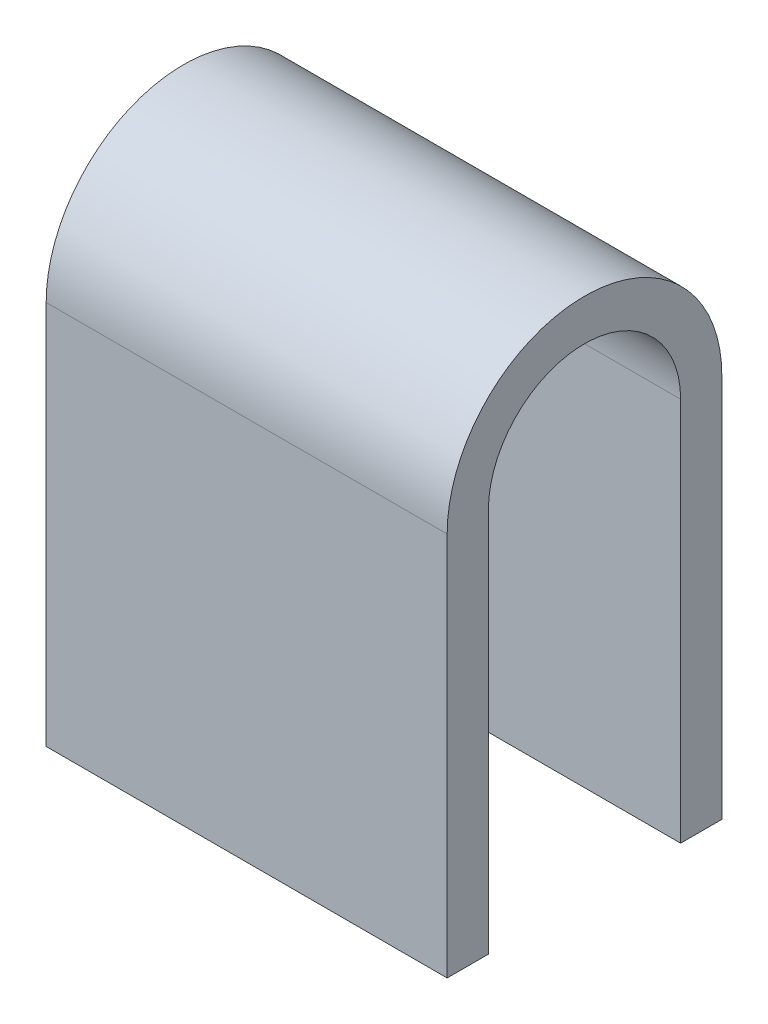
ISO-10303-21;
HEADER;
FILE_DESCRIPTION(('STEP AP214'),'2;1');
FILE_NAME('part.step','',(''),(''),'','','');
FILE_SCHEMA(('AUTOMOTIVE_DESIGN { 1 0 10303 214 1 1 1 1 }'));
ENDSEC;
DATA;
#1=APPLICATION_CONTEXT('core data for automotive mechanical design processes');
#2=APPLICATION_PROTOCOL_DEFINITION('international standard','automotive_design',2000,#1);
#3=PRODUCT_CONTEXT('',#1,'mechanical');
#4=PRODUCT('Part','Part','',(#3));
#5=PRODUCT_RELATED_PRODUCT_CATEGORY('part','',(#4));
#6=PRODUCT_DEFINITION_FORMATION('','',#4);
#7=PRODUCT_DEFINITION_CONTEXT('part definition',#1,'design');
#8=PRODUCT_DEFINITION('design','',#6,#7);
#9=PRODUCT_DEFINITION_SHAPE('','',#8);
#10=(LENGTH_UNIT() NAMED_UNIT(*) SI_UNIT(.MILLI.,.METRE.));
#11=(NAMED_UNIT(*) PLANE_ANGLE_UNIT() SI_UNIT($,.RADIAN.));
#12=(NAMED_UNIT(*) SI_UNIT($,.STERADIAN.) SOLID_ANGLE_UNIT());
#13=UNCERTAINTY_MEASURE_WITH_UNIT(LENGTH_MEASURE(1.E-05),#10,'distance_accuracy_value','');
#14=(GEOMETRIC_REPRESENTATION_CONTEXT(3) GLOBAL_UNCERTAINTY_ASSIGNED_CONTEXT((#13)) GLOBAL_UNIT_ASSIGNED_CONTEXT((#10,
#11,#12)) REPRESENTATION_CONTEXT('',''));
#15=CARTESIAN_POINT('',(0.,0.,0.));
#16=DIRECTION('',(0.,0.,1.));
#17=DIRECTION('',(1.,0.,0.));
#18=AXIS2_PLACEMENT_3D('',#15,#16,#17);
#19=CARTESIAN_POINT('',(9.271,-8.89,-1.905));
#20=DIRECTION('',(1.,0.,0.));
#21=DIRECTION('',(0.,0.,-1.));
#22=AXIS2_PLACEMENT_3D('',#19,#20,#21);
#23=PLANE('',#22);
#24=DIRECTION('',(0.,1.,0.));
#25=VECTOR('',#24,1.);
#26=CARTESIAN_POINT('',(9.271,-8.89,0.));
#27=LINE('',#26,#25);
#28=CARTESIAN_POINT('',(9.271,-8.89,0.));
#29=VERTEX_POINT('',#28);
#30=CARTESIAN_POINT('',(9.271,8.89,0.));
#31=VERTEX_POINT('',#30);
#32=EDGE_CURVE('E72',#29,#31,#27,.T.);
#33=ORIENTED_EDGE('',*,*,#32,.F.);
#34=DIRECTION('',(0.,0.,1.));
#35=VECTOR('',#34,1.);
#36=CARTESIAN_POINT('',(9.271,-8.89,-1.905));
#37=LINE('',#36,#35);
#38=CARTESIAN_POINT('',(9.271,-8.89,-1.905));
#39=VERTEX_POINT('',#38);
#40=EDGE_CURVE('E11',#39,#29,#37,.T.);
#41=ORIENTED_EDGE('',*,*,#40,.F.);
#42=DIRECTION('',(0.,1.,0.));
#43=VECTOR('',#42,1.);
#44=CARTESIAN_POINT('',(9.271,-8.89,-1.905));
#45=LINE('',#44,#43);
#46=CARTESIAN_POINT('',(9.271,8.89,-1.905));
#47=VERTEX_POINT('',#46);
#48=EDGE_CURVE('E85',#39,#47,#45,.T.);
#49=ORIENTED_EDGE('',*,*,#48,.T.);
#50=CARTESIAN_POINT('',(9.271,8.89,-6.35));
#51=DIRECTION('',(1.,0.,0.));
#52=DIRECTION('',(0.,0.,-1.));
#53=AXIS2_PLACEMENT_3D('',#50,#51,#52);
#54=CIRCLE('',#53,4.445);
#55=CARTESIAN_POINT('',(9.271,8.89,-10.795));
#56=VERTEX_POINT('',#55);
#57=EDGE_CURVE('E81',#56,#47,#54,.T.);
#58=ORIENTED_EDGE('',*,*,#57,.F.);
#59=DIRECTION('',(0.,1.,0.));
#60=VECTOR('',#59,1.);
#61=CARTESIAN_POINT('',(9.271,-8.89,-10.795));
#62=LINE('',#61,#60);
#63=CARTESIAN_POINT('',(9.271,-8.89,-10.795));
#64=VERTEX_POINT('',#63);
#65=EDGE_CURVE('E118',#64,#56,#62,.T.);
#66=ORIENTED_EDGE('',*,*,#65,.F.);
#67=DIRECTION('',(0.,0.,-1.));
#68=VECTOR('',#67,1.);
#69=CARTESIAN_POINT('',(9.271,-8.89,-10.795));
#70=LINE('',#69,#68);
#71=CARTESIAN_POINT('',(9.271,-8.89,-12.7));
#72=VERTEX_POINT('',#71);
#73=EDGE_CURVE('E115',#64,#72,#70,.T.);
#74=ORIENTED_EDGE('',*,*,#73,.T.);
#75=DIRECTION('',(0.,1.,0.));
#76=VECTOR('',#75,1.);
#77=CARTESIAN_POINT('',(9.271,-8.89,-12.7));
#78=LINE('',#77,#76);
#79=CARTESIAN_POINT('',(9.271,8.89,-12.7));
#80=VERTEX_POINT('',#79);
#81=EDGE_CURVE('E119',#72,#80,#78,.T.);
#82=ORIENTED_EDGE('',*,*,#81,.T.);
#83=CARTESIAN_POINT('',(9.271,8.89,-6.35));
#84=DIRECTION('',(1.,0.,0.));
#85=DIRECTION('',(0.,0.,-1.));
#86=AXIS2_PLACEMENT_3D('',#83,#84,#85);
#87=CIRCLE('',#86,6.35);
#88=EDGE_CURVE('E76',#31,#80,#87,.F.);
#89=ORIENTED_EDGE('',*,*,#88,.F.);
#90=EDGE_LOOP('',(#33,#41,#49,#58,#66,#74,#82,#89));
#91=FACE_BOUND('',#90,.T.);
#92=ADVANCED_FACE('F33',(#91),#23,.T.);
#93=CARTESIAN_POINT('',(-9.271,-8.89,-1.905));
#94=DIRECTION('',(0.,-1.,0.));
#95=DIRECTION('',(0.,0.,-1.));
#96=AXIS2_PLACEMENT_3D('',#93,#94,#95);
#97=PLANE('',#96);
#98=DIRECTION('',(1.,0.,0.));
#99=VECTOR('',#98,1.);
#100=CARTESIAN_POINT('',(-9.271,-8.89,0.));
#101=LINE('',#100,#99);
#102=CARTESIAN_POINT('',(-9.271,-8.89,0.));
#103=VERTEX_POINT('',#102);
#104=EDGE_CURVE('E67',#103,#29,#101,.T.);
#105=ORIENTED_EDGE('',*,*,#104,.F.);
#106=DIRECTION('',(0.,0.,1.));
#107=VECTOR('',#106,1.);
#108=CARTESIAN_POINT('',(-9.271,-8.89,-1.905));
#109=LINE('',#108,#107);
#110=CARTESIAN_POINT('',(-9.271,-8.89,-1.905));
#111=VERTEX_POINT('',#110);
#112=EDGE_CURVE('E36',#111,#103,#109,.T.);
#113=ORIENTED_EDGE('',*,*,#112,.F.);
#114=DIRECTION('',(1.,0.,0.));
#115=VECTOR('',#114,1.);
#116=CARTESIAN_POINT('',(-9.271,-8.89,-1.905));
#117=LINE('',#116,#115);
#118=EDGE_CURVE('E69',#111,#39,#117,.T.);
#119=ORIENTED_EDGE('',*,*,#118,.T.);
#120=ORIENTED_EDGE('',*,*,#40,.T.);
#121=EDGE_LOOP('',(#105,#113,#119,#120));
#122=FACE_BOUND('',#121,.T.);
#123=ADVANCED_FACE('F65',(#122),#97,.T.);
#124=CARTESIAN_POINT('',(-9.271,-8.89,-1.905));
#125=DIRECTION('',(-1.,0.,0.));
#126=DIRECTION('',(0.,0.,1.));
#127=AXIS2_PLACEMENT_3D('',#124,#125,#126);
#128=PLANE('',#127);
#129=DIRECTION('',(0.,-1.,0.));
#130=VECTOR('',#129,1.);
#131=CARTESIAN_POINT('',(-9.271,-8.89,0.));
#132=LINE('',#131,#130);
#133=CARTESIAN_POINT('',(-9.271,8.89,0.));
#134=VERTEX_POINT('',#133);
#135=EDGE_CURVE('E84',#134,#103,#132,.T.);
#136=ORIENTED_EDGE('',*,*,#135,.F.);
#137=CARTESIAN_POINT('',(-9.271,8.89,-6.35));
#138=DIRECTION('',(-1.,0.,0.));
#139=DIRECTION('',(0.,0.,1.));
#140=AXIS2_PLACEMENT_3D('',#137,#138,#139);
#141=CIRCLE('',#140,6.35);
#142=CARTESIAN_POINT('',(-9.271,8.89,-12.7));
#143=VERTEX_POINT('',#142);
#144=EDGE_CURVE('E104',#134,#143,#141,.T.);
#145=ORIENTED_EDGE('',*,*,#144,.T.);
#146=DIRECTION('',(0.,-1.,0.));
#147=VECTOR('',#146,1.);
#148=CARTESIAN_POINT('',(-9.271,-8.89,-12.7));
#149=LINE('',#148,#147);
#150=CARTESIAN_POINT('',(-9.271,-8.89,-12.7));
#151=VERTEX_POINT('',#150);
#152=EDGE_CURVE('E125',#143,#151,#149,.T.);
#153=ORIENTED_EDGE('',*,*,#152,.T.);
#154=DIRECTION('',(0.,0.,-1.));
#155=VECTOR('',#154,1.);
#156=CARTESIAN_POINT('',(-9.271,-8.89,-10.795));
#157=LINE('',#156,#155);
#158=CARTESIAN_POINT('',(-9.271,-8.89,-10.795));
#159=VERTEX_POINT('',#158);
#160=EDGE_CURVE('E110',#159,#151,#157,.T.);
#161=ORIENTED_EDGE('',*,*,#160,.F.);
#162=DIRECTION('',(0.,-1.,0.));
#163=VECTOR('',#162,1.);
#164=CARTESIAN_POINT('',(-9.271,-8.89,-10.795));
#165=LINE('',#164,#163);
#166=CARTESIAN_POINT('',(-9.271,8.89,-10.795));
#167=VERTEX_POINT('',#166);
#168=EDGE_CURVE('E121',#167,#159,#165,.T.);
#169=ORIENTED_EDGE('',*,*,#168,.F.);
#170=CARTESIAN_POINT('',(-9.271,8.89,-6.35));
#171=DIRECTION('',(1.,0.,0.));
#172=DIRECTION('',(0.,0.,-1.));
#173=AXIS2_PLACEMENT_3D('',#170,#171,#172);
#174=CIRCLE('',#173,4.445);
#175=CARTESIAN_POINT('',(-9.271,8.89,-1.905));
#176=VERTEX_POINT('',#175);
#177=EDGE_CURVE('E107',#167,#176,#174,.T.);
#178=ORIENTED_EDGE('',*,*,#177,.T.);
#179=DIRECTION('',(0.,-1.,0.));
#180=VECTOR('',#179,1.);
#181=CARTESIAN_POINT('',(-9.271,-8.89,-1.905));
#182=LINE('',#181,#180);
#183=EDGE_CURVE('E93',#176,#111,#182,.T.);
#184=ORIENTED_EDGE('',*,*,#183,.T.);
#185=ORIENTED_EDGE('',*,*,#112,.T.);
#186=EDGE_LOOP('',(#136,#145,#153,#161,#169,#178,#184,#185));
#187=FACE_BOUND('',#186,.T.);
#188=ADVANCED_FACE('F146',(#187),#128,.T.);
#189=CARTESIAN_POINT('',(0.,0.,-1.905));
#190=DIRECTION('',(0.,0.,-1.));
#191=DIRECTION('',(-1.,0.,0.));
#192=AXIS2_PLACEMENT_3D('',#189,#190,#191);
#193=PLANE('',#192);
#194=ORIENTED_EDGE('',*,*,#48,.F.);
#195=ORIENTED_EDGE('',*,*,#118,.F.);
#196=ORIENTED_EDGE('',*,*,#183,.F.);
#197=DIRECTION('',(-1.,0.,0.));
#198=VECTOR('',#197,1.);
#199=CARTESIAN_POINT('',(-9.271,8.89,-1.905));
#200=LINE('',#199,#198);
#201=EDGE_CURVE('E87',#47,#176,#200,.T.);
#202=ORIENTED_EDGE('',*,*,#201,.F.);
#203=EDGE_LOOP('',(#194,#195,#196,#202));
#204=FACE_BOUND('',#203,.T.);
#205=ADVANCED_FACE('F175',(#204),#193,.T.);
#206=CARTESIAN_POINT('',(0.,0.,0.));
#207=DIRECTION('',(0.,0.,-1.));
#208=DIRECTION('',(-1.,0.,0.));
#209=AXIS2_PLACEMENT_3D('',#206,#207,#208);
#210=PLANE('',#209);
#211=ORIENTED_EDGE('',*,*,#32,.T.);
#212=DIRECTION('',(-1.,0.,0.));
#213=VECTOR('',#212,1.);
#214=CARTESIAN_POINT('',(-9.271,8.89,0.));
#215=LINE('',#214,#213);
#216=EDGE_CURVE('E80',#31,#134,#215,.T.);
#217=ORIENTED_EDGE('',*,*,#216,.T.);
#218=ORIENTED_EDGE('',*,*,#135,.T.);
#219=ORIENTED_EDGE('',*,*,#104,.T.);
#220=EDGE_LOOP('',(#211,#217,#218,#219));
#221=FACE_BOUND('',#220,.T.);
#222=ADVANCED_FACE('F83',(#221),#210,.F.);
#223=CARTESIAN_POINT('',(23.4700316571237,8.89,-6.35));
#224=DIRECTION('',(-1.,0.,0.));
#225=DIRECTION('',(0.,0.,1.));
#226=AXIS2_PLACEMENT_3D('',#223,#224,#225);
#227=CYLINDRICAL_SURFACE('',#226,6.35);
#228=ORIENTED_EDGE('',*,*,#216,.F.);
#229=ORIENTED_EDGE('',*,*,#88,.T.);
#230=DIRECTION('',(-1.,0.,0.));
#231=VECTOR('',#230,1.);
#232=CARTESIAN_POINT('',(23.4700316571237,8.89,-12.7));
#233=LINE('',#232,#231);
#234=EDGE_CURVE('E97',#80,#143,#233,.T.);
#235=ORIENTED_EDGE('',*,*,#234,.T.);
#236=ORIENTED_EDGE('',*,*,#144,.F.);
#237=EDGE_LOOP('',(#228,#229,#235,#236));
#238=FACE_BOUND('',#237,.T.);
#239=ADVANCED_FACE('F182',(#238),#227,.T.);
#240=CARTESIAN_POINT('',(23.4700316571237,8.89,-6.35));
#241=DIRECTION('',(-1.,0.,0.));
#242=DIRECTION('',(0.,0.,1.));
#243=AXIS2_PLACEMENT_3D('',#240,#241,#242);
#244=CYLINDRICAL_SURFACE('',#243,4.445);
#245=DIRECTION('',(-1.,0.,0.));
#246=VECTOR('',#245,1.);
#247=CARTESIAN_POINT('',(23.4700316571237,8.89,-10.795));
#248=LINE('',#247,#246);
#249=EDGE_CURVE('E100',#56,#167,#248,.T.);
#250=ORIENTED_EDGE('',*,*,#249,.F.);
#251=ORIENTED_EDGE('',*,*,#57,.T.);
#252=ORIENTED_EDGE('',*,*,#201,.T.);
#253=ORIENTED_EDGE('',*,*,#177,.F.);
#254=EDGE_LOOP('',(#250,#251,#252,#253));
#255=FACE_BOUND('',#254,.T.);
#256=ADVANCED_FACE('F170',(#255),#244,.F.);
#257=CARTESIAN_POINT('',(9.271,-8.89,-10.795));
#258=DIRECTION('',(0.,1.,0.));
#259=DIRECTION('',(0.,0.,1.));
#260=AXIS2_PLACEMENT_3D('',#257,#258,#259);
#261=PLANE('',#260);
#262=DIRECTION('',(1.,0.,0.));
#263=VECTOR('',#262,1.);
#264=CARTESIAN_POINT('',(9.271,-8.89,-12.7));
#265=LINE('',#264,#263);
#266=EDGE_CURVE('E122',#151,#72,#265,.T.);
#267=ORIENTED_EDGE('',*,*,#266,.T.);
#268=ORIENTED_EDGE('',*,*,#73,.F.);
#269=DIRECTION('',(1.,0.,0.));
#270=VECTOR('',#269,1.);
#271=CARTESIAN_POINT('',(9.271,-8.89,-10.795));
#272=LINE('',#271,#270);
#273=EDGE_CURVE('E130',#159,#64,#272,.T.);
#274=ORIENTED_EDGE('',*,*,#273,.F.);
#275=ORIENTED_EDGE('',*,*,#160,.T.);
#276=EDGE_LOOP('',(#267,#268,#274,#275));
#277=FACE_BOUND('',#276,.T.);
#278=ADVANCED_FACE('F150',(#277),#261,.F.);
#279=CARTESIAN_POINT('',(0.,0.,-10.795));
#280=DIRECTION('',(0.,0.,1.));
#281=DIRECTION('',(1.,0.,0.));
#282=AXIS2_PLACEMENT_3D('',#279,#280,#281);
#283=PLANE('',#282);
#284=ORIENTED_EDGE('',*,*,#168,.T.);
#285=ORIENTED_EDGE('',*,*,#273,.T.);
#286=ORIENTED_EDGE('',*,*,#65,.T.);
#287=ORIENTED_EDGE('',*,*,#249,.T.);
#288=EDGE_LOOP('',(#284,#285,#286,#287));
#289=FACE_BOUND('',#288,.T.);
#290=ADVANCED_FACE('F138',(#289),#283,.T.);
#291=CARTESIAN_POINT('',(0.,0.,-12.7));
#292=DIRECTION('',(0.,0.,1.));
#293=DIRECTION('',(1.,0.,0.));
#294=AXIS2_PLACEMENT_3D('',#291,#292,#293);
#295=PLANE('',#294);
#296=ORIENTED_EDGE('',*,*,#152,.F.);
#297=ORIENTED_EDGE('',*,*,#234,.F.);
#298=ORIENTED_EDGE('',*,*,#81,.F.);
#299=ORIENTED_EDGE('',*,*,#266,.F.);
#300=EDGE_LOOP('',(#296,#297,#298,#299));
#301=FACE_BOUND('',#300,.T.);
#302=ADVANCED_FACE('F243',(#301),#295,.F.);
#303=CLOSED_SHELL('',(#92,#123,#188,#205,#222,#239,#256,#278,#290,#302));
#304=MANIFOLD_SOLID_BREP('B2',#303);
#305=ADVANCED_BREP_SHAPE_REPRESENTATION('',(#18,#304),#14);
#306=SHAPE_DEFINITION_REPRESENTATION(#9,#305);
ENDSEC;
END-ISO-10303-21;
